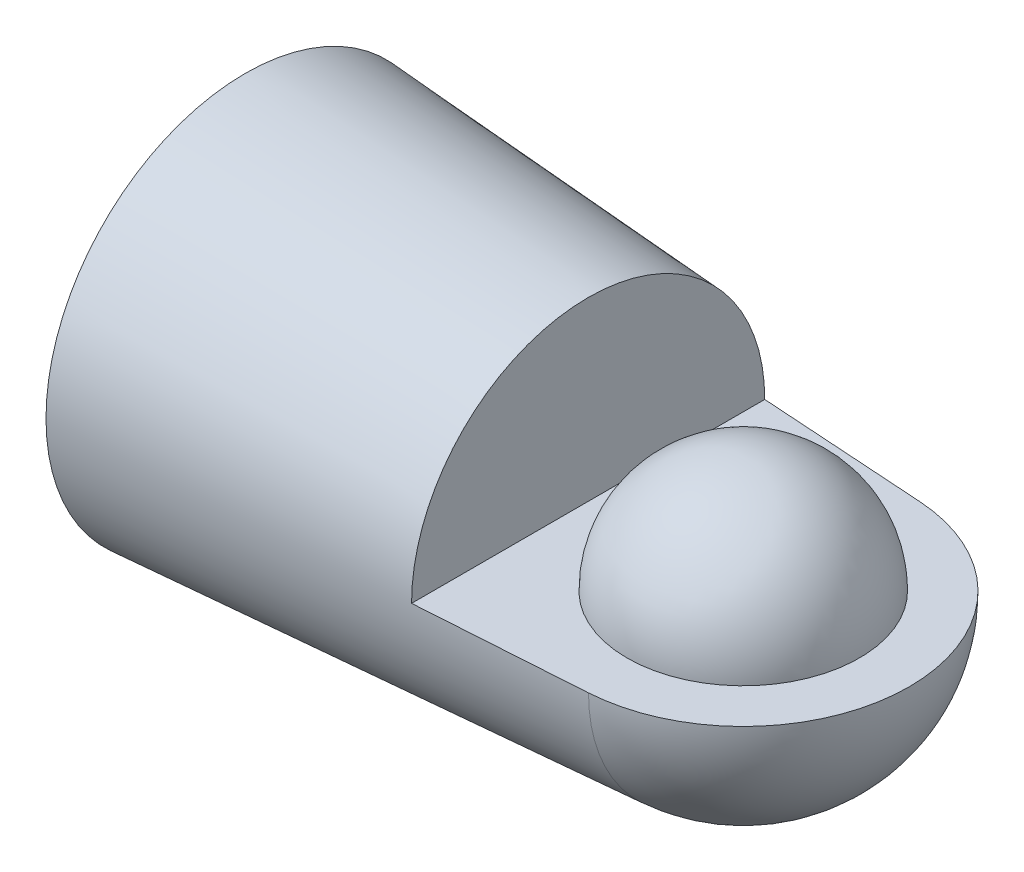
ISO-10303-21;
HEADER;
FILE_DESCRIPTION(('STEP AP214'),'2;1');
FILE_NAME('part.step','',(''),(''),'','','');
FILE_SCHEMA(('AUTOMOTIVE_DESIGN { 1 0 10303 214 1 1 1 1 }'));
ENDSEC;
DATA;
#1=APPLICATION_CONTEXT('core data for automotive mechanical design processes');
#2=APPLICATION_PROTOCOL_DEFINITION('international standard','automotive_design',2000,#1);
#3=PRODUCT_CONTEXT('',#1,'mechanical');
#4=PRODUCT('Part','Part','',(#3));
#5=PRODUCT_RELATED_PRODUCT_CATEGORY('part','',(#4));
#6=PRODUCT_DEFINITION_FORMATION('','',#4);
#7=PRODUCT_DEFINITION_CONTEXT('part definition',#1,'design');
#8=PRODUCT_DEFINITION('design','',#6,#7);
#9=PRODUCT_DEFINITION_SHAPE('','',#8);
#10=(LENGTH_UNIT() NAMED_UNIT(*) SI_UNIT(.MILLI.,.METRE.));
#11=(NAMED_UNIT(*) PLANE_ANGLE_UNIT() SI_UNIT($,.RADIAN.));
#12=(NAMED_UNIT(*) SI_UNIT($,.STERADIAN.) SOLID_ANGLE_UNIT());
#13=UNCERTAINTY_MEASURE_WITH_UNIT(LENGTH_MEASURE(1.E-05),#10,'distance_accuracy_value','');
#14=(GEOMETRIC_REPRESENTATION_CONTEXT(3) GLOBAL_UNCERTAINTY_ASSIGNED_CONTEXT((#13)) GLOBAL_UNIT_ASSIGNED_CONTEXT((#10,
#11,#12)) REPRESENTATION_CONTEXT('',''));
#15=CARTESIAN_POINT('',(0.,0.,0.));
#16=DIRECTION('',(0.,0.,1.));
#17=DIRECTION('',(1.,0.,0.));
#18=AXIS2_PLACEMENT_3D('',#15,#16,#17);
#19=CARTESIAN_POINT('',(0.,0.,0.));
#20=DIRECTION('',(1.,0.,0.));
#21=DIRECTION('',(0.,0.,1.));
#22=AXIS2_PLACEMENT_3D('',#19,#20,#21);
#23=SPHERICAL_SURFACE('',#22,50.);
#24=CARTESIAN_POINT('',(0.,0.,0.));
#25=DIRECTION('',(0.,-1.,0.));
#26=DIRECTION('',(0.,0.,-1.));
#27=AXIS2_PLACEMENT_3D('',#24,#25,#26);
#28=CIRCLE('',#27,50.);
#29=CARTESIAN_POINT('',(3.28999022498531,0.,49.8916422291299));
#30=VERTEX_POINT('',#29);
#31=CARTESIAN_POINT('',(3.2899902249853,0.,-49.8916422291299));
#32=VERTEX_POINT('',#31);
#33=EDGE_CURVE('E46',#30,#32,#28,.F.);
#34=ORIENTED_EDGE('',*,*,#33,.F.);
#35=CARTESIAN_POINT('',(3.2899902249853,0.,0.));
#36=DIRECTION('',(1.,0.,0.));
#37=DIRECTION('',(0.,0.,-1.));
#38=AXIS2_PLACEMENT_3D('',#35,#36,#37);
#39=CIRCLE('',#38,49.8916422291299);
#40=EDGE_CURVE('E64',#30,#32,#39,.T.);
#41=ORIENTED_EDGE('',*,*,#40,.T.);
#42=EDGE_LOOP('',(#34,#41));
#43=FACE_BOUND('',#42,.T.);
#44=ADVANCED_FACE('F32',(#43),#23,.T.);
#45=CARTESIAN_POINT('',(3.2899902249853,0.,0.));
#46=DIRECTION('',(-1.,0.,0.));
#47=DIRECTION('',(0.,0.,1.));
#48=AXIS2_PLACEMENT_3D('',#45,#46,#47);
#49=CONICAL_SURFACE('',#48,49.8916422291299,0.0658473785433281);
#50=DIRECTION('',(-0.997832844582599,0.,0.0657998044997062));
#51=VECTOR('',#50,1.);
#52=CARTESIAN_POINT('',(759.880677156471,0.,0.));
#53=LINE('',#52,#51);
#54=CARTESIAN_POINT('',(-46.7100097750147,0.,53.1887778594584));
#55=VERTEX_POINT('',#54);
#56=EDGE_CURVE('E39',#55,#30,#53,.F.);
#57=ORIENTED_EDGE('',*,*,#56,.F.);
#58=CARTESIAN_POINT('',(-46.7100097750147,0.,0.));
#59=DIRECTION('',(1.,0.,0.));
#60=DIRECTION('',(0.,0.,-1.));
#61=AXIS2_PLACEMENT_3D('',#58,#59,#60);
#62=CIRCLE('',#61,53.1887778594584);
#63=CARTESIAN_POINT('',(-46.7100097750147,0.,-53.1887778594584));
#64=VERTEX_POINT('',#63);
#65=EDGE_CURVE('E63',#55,#64,#62,.F.);
#66=ORIENTED_EDGE('',*,*,#65,.T.);
#67=DIRECTION('',(0.997832844582599,0.,0.0657998044997059));
#68=VECTOR('',#67,1.);
#69=CARTESIAN_POINT('',(759.880677156471,0.,0.));
#70=LINE('',#69,#68);
#71=EDGE_CURVE('E55',#32,#64,#70,.F.);
#72=ORIENTED_EDGE('',*,*,#71,.F.);
#73=ORIENTED_EDGE('',*,*,#40,.F.);
#74=EDGE_LOOP('',(#57,#66,#72,#73));
#75=FACE_BOUND('',#74,.T.);
#76=CARTESIAN_POINT('',(-150.,0.,0.));
#77=DIRECTION('',(1.,0.,0.));
#78=DIRECTION('',(0.,0.,-1.));
#79=AXIS2_PLACEMENT_3D('',#76,#77,#78);
#80=CIRCLE('',#79,60.);
#81=CARTESIAN_POINT('',(-150.,0.,-60.));
#82=VERTEX_POINT('',#81);
#83=EDGE_CURVE('E75',#82,#82,#80,.T.);
#84=ORIENTED_EDGE('',*,*,#83,.T.);
#85=EDGE_LOOP('',(#84));
#86=FACE_BOUND('',#85,.T.);
#87=ADVANCED_FACE('F70',(#75,#86),#49,.T.);
#88=CARTESIAN_POINT('',(-150.,0.,0.));
#89=DIRECTION('',(-1.,0.,0.));
#90=DIRECTION('',(0.,0.,1.));
#91=AXIS2_PLACEMENT_3D('',#88,#89,#90);
#92=PLANE('',#91);
#93=CARTESIAN_POINT('',(-150.,0.,0.));
#94=DIRECTION('',(-1.,0.,0.));
#95=DIRECTION('',(0.,0.,1.));
#96=AXIS2_PLACEMENT_3D('',#93,#94,#95);
#97=CIRCLE('',#96,50.);
#98=CARTESIAN_POINT('',(-150.,0.,50.));
#99=VERTEX_POINT('',#98);
#100=EDGE_CURVE('E79',#99,#99,#97,.T.);
#101=ORIENTED_EDGE('',*,*,#100,.F.);
#102=EDGE_LOOP('',(#101));
#103=FACE_BOUND('',#102,.T.);
#104=ORIENTED_EDGE('',*,*,#83,.F.);
#105=EDGE_LOOP('',(#104));
#106=FACE_BOUND('',#105,.T.);
#107=ADVANCED_FACE('F94',(#103,#106),#92,.T.);
#108=CARTESIAN_POINT('',(-46.7100097750147,82.,60.));
#109=DIRECTION('',(1.,0.,0.));
#110=DIRECTION('',(0.,0.,-1.));
#111=AXIS2_PLACEMENT_3D('',#108,#109,#110);
#112=PLANE('',#111);
#113=DIRECTION('',(0.,0.,1.));
#114=VECTOR('',#113,1.);
#115=CARTESIAN_POINT('',(-46.7100097750147,0.,60.));
#116=LINE('',#115,#114);
#117=EDGE_CURVE('E58',#64,#55,#116,.T.);
#118=ORIENTED_EDGE('',*,*,#117,.F.);
#119=ORIENTED_EDGE('',*,*,#65,.F.);
#120=EDGE_LOOP('',(#118,#119));
#121=FACE_BOUND('',#120,.T.);
#122=ADVANCED_FACE('F67',(#121),#112,.T.);
#123=CARTESIAN_POINT('',(0.,0.,0.));
#124=DIRECTION('',(0.,-1.,0.));
#125=DIRECTION('',(0.,0.,-1.));
#126=AXIS2_PLACEMENT_3D('',#123,#124,#125);
#127=PLANE('',#126);
#128=CARTESIAN_POINT('',(0.,0.,0.));
#129=DIRECTION('',(0.,-1.,0.));
#130=DIRECTION('',(0.,0.,-1.));
#131=AXIS2_PLACEMENT_3D('',#128,#129,#130);
#132=CIRCLE('',#131,35.);
#133=CARTESIAN_POINT('',(0.,0.,-35.));
#134=VERTEX_POINT('',#133);
#135=EDGE_CURVE('E11',#134,#134,#132,.F.);
#136=ORIENTED_EDGE('',*,*,#135,.F.);
#137=EDGE_LOOP('',(#136));
#138=FACE_BOUND('',#137,.T.);
#139=ORIENTED_EDGE('',*,*,#56,.T.);
#140=ORIENTED_EDGE('',*,*,#33,.T.);
#141=ORIENTED_EDGE('',*,*,#71,.T.);
#142=ORIENTED_EDGE('',*,*,#117,.T.);
#143=EDGE_LOOP('',(#139,#140,#141,#142));
#144=FACE_BOUND('',#143,.T.);
#145=ADVANCED_FACE('F57',(#138,#144),#127,.F.);
#146=CARTESIAN_POINT('',(0.,0.,0.));
#147=DIRECTION('',(-1.,0.,0.));
#148=DIRECTION('',(0.,0.,-1.));
#149=AXIS2_PLACEMENT_3D('',#146,#147,#148);
#150=SPHERICAL_SURFACE('',#149,35.);
#151=CARTESIAN_POINT('',(0.,0.,0.));
#152=DIRECTION('',(0.,-1.,0.));
#153=DIRECTION('',(0.,0.,-1.));
#154=AXIS2_PLACEMENT_3D('',#151,#152,#153);
#155=SPHERICAL_SURFACE('',#154,35.);
#156=ORIENTED_EDGE('',*,*,#135,.T.);
#157=EDGE_LOOP('',(#156));
#158=FACE_BOUND('',#157,.T.);
#159=ADVANCED_FACE('F90',(#158),#155,.T.);
#160=CARTESIAN_POINT('',(-130.,0.,0.));
#161=DIRECTION('',(-1.,0.,0.));
#162=DIRECTION('',(0.,0.,1.));
#163=AXIS2_PLACEMENT_3D('',#160,#161,#162);
#164=CYLINDRICAL_SURFACE('',#163,50.);
#165=CARTESIAN_POINT('',(-130.,0.,0.));
#166=DIRECTION('',(-1.,0.,0.));
#167=DIRECTION('',(0.,0.,1.));
#168=AXIS2_PLACEMENT_3D('',#165,#166,#167);
#169=CIRCLE('',#168,50.);
#170=CARTESIAN_POINT('',(-130.,0.,50.));
#171=VERTEX_POINT('',#170);
#172=EDGE_CURVE('E68',#171,#171,#169,.T.);
#173=ORIENTED_EDGE('',*,*,#172,.F.);
#174=EDGE_LOOP('',(#173));
#175=FACE_BOUND('',#174,.T.);
#176=ORIENTED_EDGE('',*,*,#100,.T.);
#177=EDGE_LOOP('',(#176));
#178=FACE_BOUND('',#177,.T.);
#179=ADVANCED_FACE('F87',(#175,#178),#164,.F.);
#180=CARTESIAN_POINT('',(-130.,0.,0.));
#181=DIRECTION('',(-1.,0.,0.));
#182=DIRECTION('',(0.,0.,1.));
#183=AXIS2_PLACEMENT_3D('',#180,#181,#182);
#184=PLANE('',#183);
#185=ORIENTED_EDGE('',*,*,#172,.T.);
#186=EDGE_LOOP('',(#185));
#187=FACE_BOUND('',#186,.T.);
#188=ADVANCED_FACE('F85',(#187),#184,.T.);
#189=CLOSED_SHELL('',(#44,#87,#107,#122,#145,#159,#179,#188));
#190=MANIFOLD_SOLID_BREP('B2',#189);
#191=ADVANCED_BREP_SHAPE_REPRESENTATION('',(#18,#190),#14);
#192=SHAPE_DEFINITION_REPRESENTATION(#9,#191);
ENDSEC;
END-ISO-10303-21;
